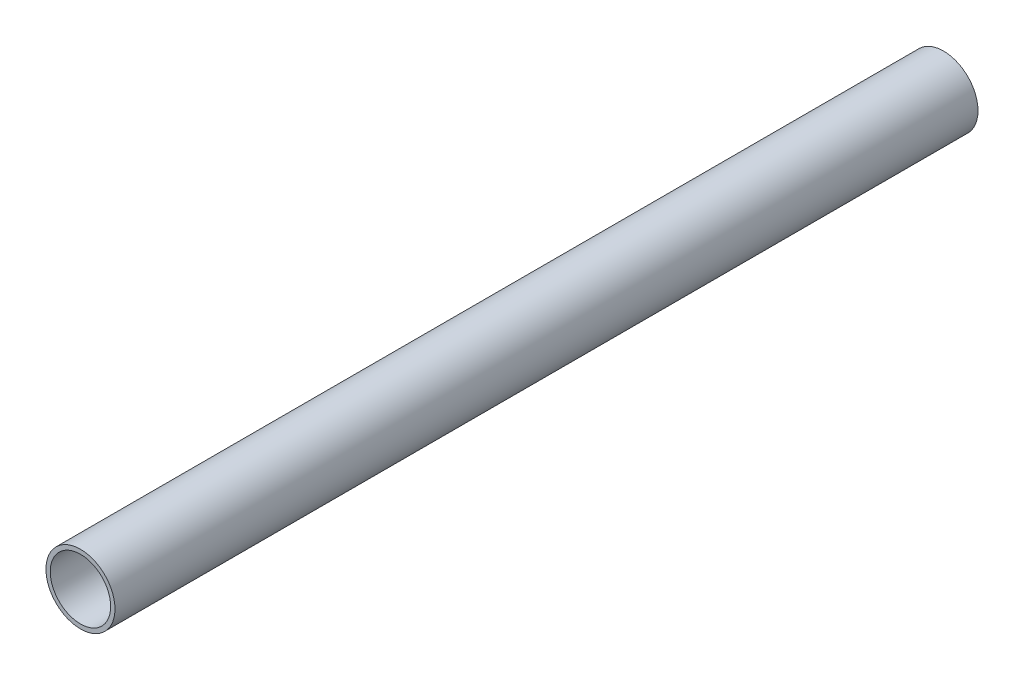
ISO-10303-21;
HEADER;
FILE_DESCRIPTION(('STEP AP214'),'2;1');
FILE_NAME('part.step','',(''),(''),'','','');
FILE_SCHEMA(('AUTOMOTIVE_DESIGN { 1 0 10303 214 1 1 1 1 }'));
ENDSEC;
DATA;
#1=APPLICATION_CONTEXT('core data for automotive mechanical design processes');
#2=APPLICATION_PROTOCOL_DEFINITION('international standard','automotive_design',2000,#1);
#3=PRODUCT_CONTEXT('',#1,'mechanical');
#4=PRODUCT('Part','Part','',(#3));
#5=PRODUCT_RELATED_PRODUCT_CATEGORY('part','',(#4));
#6=PRODUCT_DEFINITION_FORMATION('','',#4);
#7=PRODUCT_DEFINITION_CONTEXT('part definition',#1,'design');
#8=PRODUCT_DEFINITION('design','',#6,#7);
#9=PRODUCT_DEFINITION_SHAPE('','',#8);
#10=(LENGTH_UNIT() NAMED_UNIT(*) SI_UNIT(.MILLI.,.METRE.));
#11=(NAMED_UNIT(*) PLANE_ANGLE_UNIT() SI_UNIT($,.RADIAN.));
#12=(NAMED_UNIT(*) SI_UNIT($,.STERADIAN.) SOLID_ANGLE_UNIT());
#13=UNCERTAINTY_MEASURE_WITH_UNIT(LENGTH_MEASURE(1.E-05),#10,'distance_accuracy_value','');
#14=(GEOMETRIC_REPRESENTATION_CONTEXT(3) GLOBAL_UNCERTAINTY_ASSIGNED_CONTEXT((#13)) GLOBAL_UNIT_ASSIGNED_CONTEXT((#10,
#11,#12)) REPRESENTATION_CONTEXT('',''));
#15=CARTESIAN_POINT('',(0.,0.,0.));
#16=DIRECTION('',(0.,0.,1.));
#17=DIRECTION('',(1.,0.,0.));
#18=AXIS2_PLACEMENT_3D('',#15,#16,#17);
#19=CARTESIAN_POINT('',(0.,0.,100.));
#20=DIRECTION('',(0.,0.,1.));
#21=DIRECTION('',(1.,0.,0.));
#22=AXIS2_PLACEMENT_3D('',#19,#20,#21);
#23=PLANE('',#22);
#24=CARTESIAN_POINT('',(0.,0.,100.));
#25=DIRECTION('',(0.,0.,1.));
#26=DIRECTION('',(1.,0.,0.));
#27=AXIS2_PLACEMENT_3D('',#24,#25,#26);
#28=CIRCLE('',#27,8.);
#29=CARTESIAN_POINT('',(8.,0.,100.));
#30=VERTEX_POINT('',#29);
#31=EDGE_CURVE('E10',#30,#30,#28,.T.);
#32=ORIENTED_EDGE('',*,*,#31,.T.);
#33=EDGE_LOOP('',(#32));
#34=FACE_BOUND('',#33,.T.);
#35=CARTESIAN_POINT('',(0.,0.,100.));
#36=DIRECTION('',(0.,0.,1.));
#37=DIRECTION('',(1.,0.,0.));
#38=AXIS2_PLACEMENT_3D('',#35,#36,#37);
#39=CIRCLE('',#38,7.);
#40=CARTESIAN_POINT('',(7.,0.,100.));
#41=VERTEX_POINT('',#40);
#42=EDGE_CURVE('E42',#41,#41,#39,.T.);
#43=ORIENTED_EDGE('',*,*,#42,.F.);
#44=EDGE_LOOP('',(#43));
#45=FACE_BOUND('',#44,.T.);
#46=ADVANCED_FACE('F31',(#34,#45),#23,.T.);
#47=CARTESIAN_POINT('',(0.,0.,-100.));
#48=DIRECTION('',(0.,0.,1.));
#49=DIRECTION('',(1.,0.,0.));
#50=AXIS2_PLACEMENT_3D('',#47,#48,#49);
#51=PLANE('',#50);
#52=CARTESIAN_POINT('',(0.,0.,-100.));
#53=DIRECTION('',(0.,0.,1.));
#54=DIRECTION('',(1.,0.,0.));
#55=AXIS2_PLACEMENT_3D('',#52,#53,#54);
#56=CIRCLE('',#55,8.);
#57=CARTESIAN_POINT('',(8.,0.,-100.));
#58=VERTEX_POINT('',#57);
#59=EDGE_CURVE('E35',#58,#58,#56,.T.);
#60=ORIENTED_EDGE('',*,*,#59,.F.);
#61=EDGE_LOOP('',(#60));
#62=FACE_BOUND('',#61,.T.);
#63=CARTESIAN_POINT('',(0.,0.,-100.));
#64=DIRECTION('',(0.,0.,1.));
#65=DIRECTION('',(1.,0.,0.));
#66=AXIS2_PLACEMENT_3D('',#63,#64,#65);
#67=CIRCLE('',#66,7.);
#68=CARTESIAN_POINT('',(7.,0.,-100.));
#69=VERTEX_POINT('',#68);
#70=EDGE_CURVE('E44',#69,#69,#67,.T.);
#71=ORIENTED_EDGE('',*,*,#70,.T.);
#72=EDGE_LOOP('',(#71));
#73=FACE_BOUND('',#72,.T.);
#74=ADVANCED_FACE('F54',(#62,#73),#51,.F.);
#75=CARTESIAN_POINT('',(0.,0.,100.));
#76=DIRECTION('',(0.,0.,-1.));
#77=DIRECTION('',(-1.,0.,0.));
#78=AXIS2_PLACEMENT_3D('',#75,#76,#77);
#79=CYLINDRICAL_SURFACE('',#78,8.);
#80=ORIENTED_EDGE('',*,*,#31,.F.);
#81=EDGE_LOOP('',(#80));
#82=FACE_BOUND('',#81,.T.);
#83=ORIENTED_EDGE('',*,*,#59,.T.);
#84=EDGE_LOOP('',(#83));
#85=FACE_BOUND('',#84,.T.);
#86=ADVANCED_FACE('F33',(#82,#85),#79,.T.);
#87=CARTESIAN_POINT('',(0.,0.,100.));
#88=DIRECTION('',(0.,0.,-1.));
#89=DIRECTION('',(-1.,0.,0.));
#90=AXIS2_PLACEMENT_3D('',#87,#88,#89);
#91=CYLINDRICAL_SURFACE('',#90,7.);
#92=ORIENTED_EDGE('',*,*,#42,.T.);
#93=EDGE_LOOP('',(#92));
#94=FACE_BOUND('',#93,.T.);
#95=ORIENTED_EDGE('',*,*,#70,.F.);
#96=EDGE_LOOP('',(#95));
#97=FACE_BOUND('',#96,.T.);
#98=ADVANCED_FACE('F50',(#94,#97),#91,.F.);
#99=CLOSED_SHELL('',(#46,#74,#86,#98));
#100=MANIFOLD_SOLID_BREP('B2',#99);
#101=ADVANCED_BREP_SHAPE_REPRESENTATION('',(#18,#100),#14);
#102=SHAPE_DEFINITION_REPRESENTATION(#9,#101);
ENDSEC;
END-ISO-10303-21;
